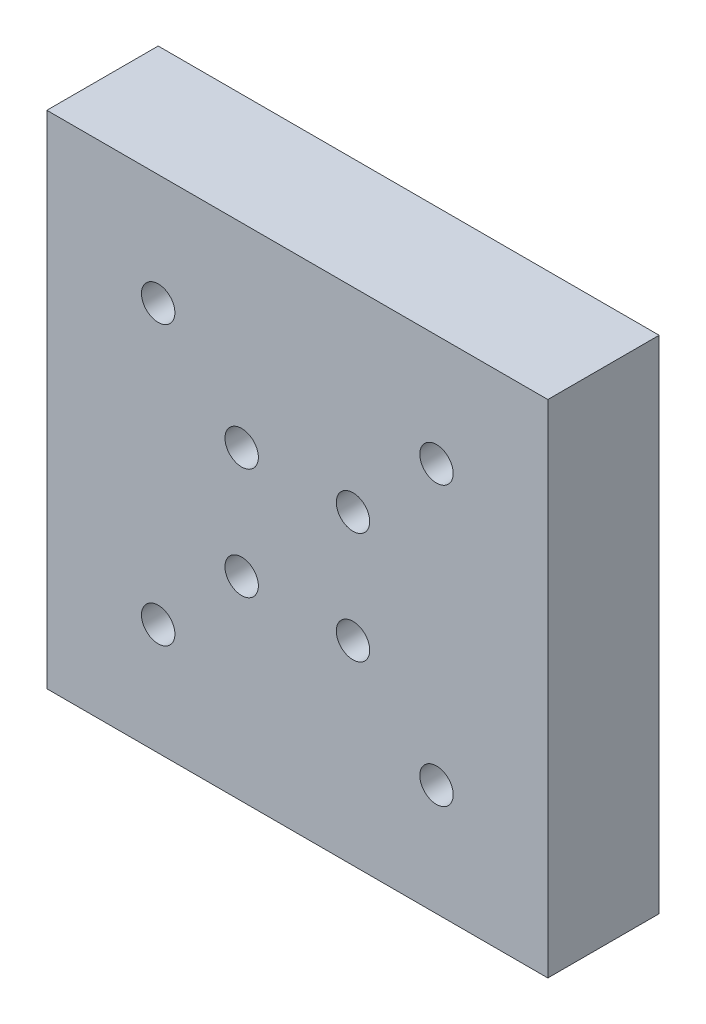
ISO-10303-21;
HEADER;
FILE_DESCRIPTION(('STEP AP214'),'2;1');
FILE_NAME('part.step','',(''),(''),'','','');
FILE_SCHEMA(('AUTOMOTIVE_DESIGN { 1 0 10303 214 1 1 1 1 }'));
ENDSEC;
DATA;
#1=APPLICATION_CONTEXT('core data for automotive mechanical design processes');
#2=APPLICATION_PROTOCOL_DEFINITION('international standard','automotive_design',2000,#1);
#3=PRODUCT_CONTEXT('',#1,'mechanical');
#4=PRODUCT('Part','Part','',(#3));
#5=PRODUCT_RELATED_PRODUCT_CATEGORY('part','',(#4));
#6=PRODUCT_DEFINITION_FORMATION('','',#4);
#7=PRODUCT_DEFINITION_CONTEXT('part definition',#1,'design');
#8=PRODUCT_DEFINITION('design','',#6,#7);
#9=PRODUCT_DEFINITION_SHAPE('','',#8);
#10=(LENGTH_UNIT() NAMED_UNIT(*) SI_UNIT(.MILLI.,.METRE.));
#11=(NAMED_UNIT(*) PLANE_ANGLE_UNIT() SI_UNIT($,.RADIAN.));
#12=(NAMED_UNIT(*) SI_UNIT($,.STERADIAN.) SOLID_ANGLE_UNIT());
#13=UNCERTAINTY_MEASURE_WITH_UNIT(LENGTH_MEASURE(1.E-05),#10,'distance_accuracy_value','');
#14=(GEOMETRIC_REPRESENTATION_CONTEXT(3) GLOBAL_UNCERTAINTY_ASSIGNED_CONTEXT((#13)) GLOBAL_UNIT_ASSIGNED_CONTEXT((#10,
#11,#12)) REPRESENTATION_CONTEXT('',''));
#15=CARTESIAN_POINT('',(0.,0.,0.));
#16=DIRECTION('',(0.,0.,1.));
#17=DIRECTION('',(1.,0.,0.));
#18=AXIS2_PLACEMENT_3D('',#15,#16,#17);
#19=CARTESIAN_POINT('',(22.5,22.5,10.));
#20=DIRECTION('',(-1.,0.,0.));
#21=DIRECTION('',(0.,-1.,0.));
#22=AXIS2_PLACEMENT_3D('',#19,#20,#21);
#23=PLANE('',#22);
#24=DIRECTION('',(0.,1.,0.));
#25=VECTOR('',#24,1.);
#26=CARTESIAN_POINT('',(22.5,22.5,0.));
#27=LINE('',#26,#25);
#28=CARTESIAN_POINT('',(22.5,-22.5,0.));
#29=VERTEX_POINT('',#28);
#30=CARTESIAN_POINT('',(22.5,22.5,0.));
#31=VERTEX_POINT('',#30);
#32=EDGE_CURVE('E104',#29,#31,#27,.T.);
#33=ORIENTED_EDGE('',*,*,#32,.T.);
#34=DIRECTION('',(0.,0.,-1.));
#35=VECTOR('',#34,1.);
#36=CARTESIAN_POINT('',(22.5,22.5,10.));
#37=LINE('',#36,#35);
#38=CARTESIAN_POINT('',(22.5,22.5,10.));
#39=VERTEX_POINT('',#38);
#40=EDGE_CURVE('E11',#39,#31,#37,.T.);
#41=ORIENTED_EDGE('',*,*,#40,.F.);
#42=DIRECTION('',(0.,1.,0.));
#43=VECTOR('',#42,1.);
#44=CARTESIAN_POINT('',(22.5,22.5,10.));
#45=LINE('',#44,#43);
#46=CARTESIAN_POINT('',(22.5,-22.5,10.));
#47=VERTEX_POINT('',#46);
#48=EDGE_CURVE('E92',#47,#39,#45,.T.);
#49=ORIENTED_EDGE('',*,*,#48,.F.);
#50=DIRECTION('',(0.,0.,-1.));
#51=VECTOR('',#50,1.);
#52=CARTESIAN_POINT('',(22.5,-22.5,10.));
#53=LINE('',#52,#51);
#54=EDGE_CURVE('E100',#47,#29,#53,.T.);
#55=ORIENTED_EDGE('',*,*,#54,.T.);
#56=EDGE_LOOP('',(#33,#41,#49,#55));
#57=FACE_BOUND('',#56,.T.);
#58=ADVANCED_FACE('F41',(#57),#23,.F.);
#59=CARTESIAN_POINT('',(-22.5,22.5,10.));
#60=DIRECTION('',(0.,-1.,0.));
#61=DIRECTION('',(0.,0.,-1.));
#62=AXIS2_PLACEMENT_3D('',#59,#60,#61);
#63=PLANE('',#62);
#64=DIRECTION('',(-1.,0.,0.));
#65=VECTOR('',#64,1.);
#66=CARTESIAN_POINT('',(-22.5,22.5,0.));
#67=LINE('',#66,#65);
#68=CARTESIAN_POINT('',(-22.5,22.5,0.));
#69=VERTEX_POINT('',#68);
#70=EDGE_CURVE('E96',#31,#69,#67,.T.);
#71=ORIENTED_EDGE('',*,*,#70,.T.);
#72=DIRECTION('',(0.,0.,-1.));
#73=VECTOR('',#72,1.);
#74=CARTESIAN_POINT('',(-22.5,22.5,10.));
#75=LINE('',#74,#73);
#76=CARTESIAN_POINT('',(-22.5,22.5,10.));
#77=VERTEX_POINT('',#76);
#78=EDGE_CURVE('E49',#77,#69,#75,.T.);
#79=ORIENTED_EDGE('',*,*,#78,.F.);
#80=DIRECTION('',(-1.,0.,0.));
#81=VECTOR('',#80,1.);
#82=CARTESIAN_POINT('',(-22.5,22.5,10.));
#83=LINE('',#82,#81);
#84=EDGE_CURVE('E87',#39,#77,#83,.T.);
#85=ORIENTED_EDGE('',*,*,#84,.F.);
#86=ORIENTED_EDGE('',*,*,#40,.T.);
#87=EDGE_LOOP('',(#71,#79,#85,#86));
#88=FACE_BOUND('',#87,.T.);
#89=ADVANCED_FACE('F95',(#88),#63,.F.);
#90=CARTESIAN_POINT('',(-22.5,22.5,10.));
#91=DIRECTION('',(1.,0.,0.));
#92=DIRECTION('',(0.,1.,0.));
#93=AXIS2_PLACEMENT_3D('',#90,#91,#92);
#94=PLANE('',#93);
#95=DIRECTION('',(0.,-1.,0.));
#96=VECTOR('',#95,1.);
#97=CARTESIAN_POINT('',(-22.5,22.5,0.));
#98=LINE('',#97,#96);
#99=CARTESIAN_POINT('',(-22.5,-22.5,0.));
#100=VERTEX_POINT('',#99);
#101=EDGE_CURVE('E74',#69,#100,#98,.T.);
#102=ORIENTED_EDGE('',*,*,#101,.T.);
#103=DIRECTION('',(0.,0.,-1.));
#104=VECTOR('',#103,1.);
#105=CARTESIAN_POINT('',(-22.5,-22.5,10.));
#106=LINE('',#105,#104);
#107=CARTESIAN_POINT('',(-22.5,-22.5,10.));
#108=VERTEX_POINT('',#107);
#109=EDGE_CURVE('E97',#108,#100,#106,.T.);
#110=ORIENTED_EDGE('',*,*,#109,.F.);
#111=DIRECTION('',(0.,-1.,0.));
#112=VECTOR('',#111,1.);
#113=CARTESIAN_POINT('',(-22.5,22.5,10.));
#114=LINE('',#113,#112);
#115=EDGE_CURVE('E90',#77,#108,#114,.T.);
#116=ORIENTED_EDGE('',*,*,#115,.F.);
#117=ORIENTED_EDGE('',*,*,#78,.T.);
#118=EDGE_LOOP('',(#102,#110,#116,#117));
#119=FACE_BOUND('',#118,.T.);
#120=ADVANCED_FACE('F98',(#119),#94,.F.);
#121=CARTESIAN_POINT('',(-22.5,-22.5,10.));
#122=DIRECTION('',(0.,1.,0.));
#123=DIRECTION('',(0.,0.,1.));
#124=AXIS2_PLACEMENT_3D('',#121,#122,#123);
#125=PLANE('',#124);
#126=DIRECTION('',(1.,0.,0.));
#127=VECTOR('',#126,1.);
#128=CARTESIAN_POINT('',(-22.5,-22.5,0.));
#129=LINE('',#128,#127);
#130=EDGE_CURVE('E80',#100,#29,#129,.T.);
#131=ORIENTED_EDGE('',*,*,#130,.T.);
#132=ORIENTED_EDGE('',*,*,#54,.F.);
#133=DIRECTION('',(1.,0.,0.));
#134=VECTOR('',#133,1.);
#135=CARTESIAN_POINT('',(-22.5,-22.5,10.));
#136=LINE('',#135,#134);
#137=EDGE_CURVE('E57',#108,#47,#136,.T.);
#138=ORIENTED_EDGE('',*,*,#137,.F.);
#139=ORIENTED_EDGE('',*,*,#109,.T.);
#140=EDGE_LOOP('',(#131,#132,#138,#139));
#141=FACE_BOUND('',#140,.T.);
#142=ADVANCED_FACE('F112',(#141),#125,.F.);
#143=CARTESIAN_POINT('',(0.,0.,10.));
#144=DIRECTION('',(0.,0.,1.));
#145=DIRECTION('',(1.,0.,0.));
#146=AXIS2_PLACEMENT_3D('',#143,#144,#145);
#147=PLANE('',#146);
#148=CARTESIAN_POINT('',(-5.,-5.,10.));
#149=DIRECTION('',(0.,0.,1.));
#150=DIRECTION('',(1.,0.,0.));
#151=AXIS2_PLACEMENT_3D('',#148,#149,#150);
#152=CIRCLE('',#151,1.5);
#153=CARTESIAN_POINT('',(-3.5,-5.,10.));
#154=VERTEX_POINT('',#153);
#155=EDGE_CURVE('E151',#154,#154,#152,.T.);
#156=ORIENTED_EDGE('',*,*,#155,.F.);
#157=EDGE_LOOP('',(#156));
#158=FACE_BOUND('',#157,.T.);
#159=CARTESIAN_POINT('',(5.,-5.,10.));
#160=DIRECTION('',(0.,0.,1.));
#161=DIRECTION('',(1.,0.,0.));
#162=AXIS2_PLACEMENT_3D('',#159,#160,#161);
#163=CIRCLE('',#162,1.5);
#164=CARTESIAN_POINT('',(6.5,-5.,10.));
#165=VERTEX_POINT('',#164);
#166=EDGE_CURVE('E157',#165,#165,#163,.T.);
#167=ORIENTED_EDGE('',*,*,#166,.F.);
#168=EDGE_LOOP('',(#167));
#169=FACE_BOUND('',#168,.T.);
#170=CARTESIAN_POINT('',(5.,5.,10.));
#171=DIRECTION('',(0.,0.,1.));
#172=DIRECTION('',(1.,0.,0.));
#173=AXIS2_PLACEMENT_3D('',#170,#171,#172);
#174=CIRCLE('',#173,1.5);
#175=CARTESIAN_POINT('',(6.5,5.,10.));
#176=VERTEX_POINT('',#175);
#177=EDGE_CURVE('E145',#176,#176,#174,.T.);
#178=ORIENTED_EDGE('',*,*,#177,.F.);
#179=EDGE_LOOP('',(#178));
#180=FACE_BOUND('',#179,.T.);
#181=CARTESIAN_POINT('',(-5.,5.,10.));
#182=DIRECTION('',(0.,0.,1.));
#183=DIRECTION('',(1.,0.,0.));
#184=AXIS2_PLACEMENT_3D('',#181,#182,#183);
#185=CIRCLE('',#184,1.5);
#186=CARTESIAN_POINT('',(-3.5,5.,10.));
#187=VERTEX_POINT('',#186);
#188=EDGE_CURVE('E142',#187,#187,#185,.T.);
#189=ORIENTED_EDGE('',*,*,#188,.F.);
#190=EDGE_LOOP('',(#189));
#191=FACE_BOUND('',#190,.T.);
#192=CARTESIAN_POINT('',(-12.5,-12.5,10.));
#193=DIRECTION('',(0.,0.,1.));
#194=DIRECTION('',(1.,0.,0.));
#195=AXIS2_PLACEMENT_3D('',#192,#193,#194);
#196=CIRCLE('',#195,1.5);
#197=CARTESIAN_POINT('',(-11.,-12.5,10.));
#198=VERTEX_POINT('',#197);
#199=EDGE_CURVE('E127',#198,#198,#196,.T.);
#200=ORIENTED_EDGE('',*,*,#199,.F.);
#201=EDGE_LOOP('',(#200));
#202=FACE_BOUND('',#201,.T.);
#203=CARTESIAN_POINT('',(12.5,-12.5,10.));
#204=DIRECTION('',(0.,0.,1.));
#205=DIRECTION('',(1.,0.,0.));
#206=AXIS2_PLACEMENT_3D('',#203,#204,#205);
#207=CIRCLE('',#206,1.5);
#208=CARTESIAN_POINT('',(14.,-12.5,10.));
#209=VERTEX_POINT('',#208);
#210=EDGE_CURVE('E134',#209,#209,#207,.T.);
#211=ORIENTED_EDGE('',*,*,#210,.F.);
#212=EDGE_LOOP('',(#211));
#213=FACE_BOUND('',#212,.T.);
#214=CARTESIAN_POINT('',(12.5,12.5,10.));
#215=DIRECTION('',(0.,0.,1.));
#216=DIRECTION('',(1.,0.,0.));
#217=AXIS2_PLACEMENT_3D('',#214,#215,#216);
#218=CIRCLE('',#217,1.5);
#219=CARTESIAN_POINT('',(14.,12.5,10.));
#220=VERTEX_POINT('',#219);
#221=EDGE_CURVE('E121',#220,#220,#218,.T.);
#222=ORIENTED_EDGE('',*,*,#221,.F.);
#223=EDGE_LOOP('',(#222));
#224=FACE_BOUND('',#223,.T.);
#225=CARTESIAN_POINT('',(-12.5,12.5,10.));
#226=DIRECTION('',(0.,0.,1.));
#227=DIRECTION('',(1.,0.,0.));
#228=AXIS2_PLACEMENT_3D('',#225,#226,#227);
#229=CIRCLE('',#228,1.5);
#230=CARTESIAN_POINT('',(-11.,12.5,10.));
#231=VERTEX_POINT('',#230);
#232=EDGE_CURVE('E118',#231,#231,#229,.T.);
#233=ORIENTED_EDGE('',*,*,#232,.F.);
#234=EDGE_LOOP('',(#233));
#235=FACE_BOUND('',#234,.T.);
#236=ORIENTED_EDGE('',*,*,#48,.T.);
#237=ORIENTED_EDGE('',*,*,#84,.T.);
#238=ORIENTED_EDGE('',*,*,#115,.T.);
#239=ORIENTED_EDGE('',*,*,#137,.T.);
#240=EDGE_LOOP('',(#236,#237,#238,#239));
#241=FACE_BOUND('',#240,.T.);
#242=ADVANCED_FACE('F88',(#158,#169,#180,#191,#202,#213,#224,#235,#241),#147,.T.);
#243=CARTESIAN_POINT('',(0.,0.,0.));
#244=DIRECTION('',(0.,0.,1.));
#245=DIRECTION('',(1.,0.,0.));
#246=AXIS2_PLACEMENT_3D('',#243,#244,#245);
#247=PLANE('',#246);
#248=CARTESIAN_POINT('',(-5.,-5.,0.));
#249=DIRECTION('',(0.,0.,1.));
#250=DIRECTION('',(1.,0.,0.));
#251=AXIS2_PLACEMENT_3D('',#248,#249,#250);
#252=CIRCLE('',#251,1.5);
#253=CARTESIAN_POINT('',(-3.5,-5.,0.));
#254=VERTEX_POINT('',#253);
#255=EDGE_CURVE('E148',#254,#254,#252,.T.);
#256=ORIENTED_EDGE('',*,*,#255,.T.);
#257=EDGE_LOOP('',(#256));
#258=FACE_BOUND('',#257,.T.);
#259=CARTESIAN_POINT('',(5.,-5.,0.));
#260=DIRECTION('',(0.,0.,1.));
#261=DIRECTION('',(1.,0.,0.));
#262=AXIS2_PLACEMENT_3D('',#259,#260,#261);
#263=CIRCLE('',#262,1.5);
#264=CARTESIAN_POINT('',(6.5,-5.,0.));
#265=VERTEX_POINT('',#264);
#266=EDGE_CURVE('E154',#265,#265,#263,.T.);
#267=ORIENTED_EDGE('',*,*,#266,.T.);
#268=EDGE_LOOP('',(#267));
#269=FACE_BOUND('',#268,.T.);
#270=CARTESIAN_POINT('',(5.,5.,0.));
#271=DIRECTION('',(0.,0.,1.));
#272=DIRECTION('',(1.,0.,0.));
#273=AXIS2_PLACEMENT_3D('',#270,#271,#272);
#274=CIRCLE('',#273,1.5);
#275=CARTESIAN_POINT('',(6.5,5.,0.));
#276=VERTEX_POINT('',#275);
#277=EDGE_CURVE('E160',#276,#276,#274,.T.);
#278=ORIENTED_EDGE('',*,*,#277,.T.);
#279=EDGE_LOOP('',(#278));
#280=FACE_BOUND('',#279,.T.);
#281=CARTESIAN_POINT('',(-5.,5.,0.));
#282=DIRECTION('',(0.,0.,1.));
#283=DIRECTION('',(1.,0.,0.));
#284=AXIS2_PLACEMENT_3D('',#281,#282,#283);
#285=CIRCLE('',#284,1.5);
#286=CARTESIAN_POINT('',(-3.5,5.,0.));
#287=VERTEX_POINT('',#286);
#288=EDGE_CURVE('E128',#287,#287,#285,.T.);
#289=ORIENTED_EDGE('',*,*,#288,.T.);
#290=EDGE_LOOP('',(#289));
#291=FACE_BOUND('',#290,.T.);
#292=CARTESIAN_POINT('',(-12.5,-12.5,0.));
#293=DIRECTION('',(0.,0.,1.));
#294=DIRECTION('',(1.,0.,0.));
#295=AXIS2_PLACEMENT_3D('',#292,#293,#294);
#296=CIRCLE('',#295,1.5);
#297=CARTESIAN_POINT('',(-11.,-12.5,0.));
#298=VERTEX_POINT('',#297);
#299=EDGE_CURVE('E124',#298,#298,#296,.T.);
#300=ORIENTED_EDGE('',*,*,#299,.T.);
#301=EDGE_LOOP('',(#300));
#302=FACE_BOUND('',#301,.T.);
#303=CARTESIAN_POINT('',(12.5,-12.5,0.));
#304=DIRECTION('',(0.,0.,1.));
#305=DIRECTION('',(1.,0.,0.));
#306=AXIS2_PLACEMENT_3D('',#303,#304,#305);
#307=CIRCLE('',#306,1.5);
#308=CARTESIAN_POINT('',(14.,-12.5,0.));
#309=VERTEX_POINT('',#308);
#310=EDGE_CURVE('E131',#309,#309,#307,.T.);
#311=ORIENTED_EDGE('',*,*,#310,.T.);
#312=EDGE_LOOP('',(#311));
#313=FACE_BOUND('',#312,.T.);
#314=CARTESIAN_POINT('',(12.5,12.5,0.));
#315=DIRECTION('',(0.,0.,1.));
#316=DIRECTION('',(1.,0.,0.));
#317=AXIS2_PLACEMENT_3D('',#314,#315,#316);
#318=CIRCLE('',#317,1.5);
#319=CARTESIAN_POINT('',(14.,12.5,0.));
#320=VERTEX_POINT('',#319);
#321=EDGE_CURVE('E137',#320,#320,#318,.T.);
#322=ORIENTED_EDGE('',*,*,#321,.T.);
#323=EDGE_LOOP('',(#322));
#324=FACE_BOUND('',#323,.T.);
#325=CARTESIAN_POINT('',(-12.5,12.5,0.));
#326=DIRECTION('',(0.,0.,1.));
#327=DIRECTION('',(1.,0.,0.));
#328=AXIS2_PLACEMENT_3D('',#325,#326,#327);
#329=CIRCLE('',#328,1.5);
#330=CARTESIAN_POINT('',(-11.,12.5,0.));
#331=VERTEX_POINT('',#330);
#332=EDGE_CURVE('E107',#331,#331,#329,.T.);
#333=ORIENTED_EDGE('',*,*,#332,.T.);
#334=EDGE_LOOP('',(#333));
#335=FACE_BOUND('',#334,.T.);
#336=ORIENTED_EDGE('',*,*,#32,.F.);
#337=ORIENTED_EDGE('',*,*,#130,.F.);
#338=ORIENTED_EDGE('',*,*,#101,.F.);
#339=ORIENTED_EDGE('',*,*,#70,.F.);
#340=EDGE_LOOP('',(#336,#337,#338,#339));
#341=FACE_BOUND('',#340,.T.);
#342=ADVANCED_FACE('F115',(#258,#269,#280,#291,#302,#313,#324,#335,#341),#247,.F.);
#343=CARTESIAN_POINT('',(-12.5,12.5,0.));
#344=DIRECTION('',(0.,0.,1.));
#345=DIRECTION('',(1.,0.,0.));
#346=AXIS2_PLACEMENT_3D('',#343,#344,#345);
#347=CYLINDRICAL_SURFACE('',#346,1.5);
#348=ORIENTED_EDGE('',*,*,#332,.F.);
#349=EDGE_LOOP('',(#348));
#350=FACE_BOUND('',#349,.T.);
#351=ORIENTED_EDGE('',*,*,#232,.T.);
#352=EDGE_LOOP('',(#351));
#353=FACE_BOUND('',#352,.T.);
#354=ADVANCED_FACE('F182',(#350,#353),#347,.F.);
#355=CARTESIAN_POINT('',(12.5,12.5,0.));
#356=DIRECTION('',(0.,0.,1.));
#357=DIRECTION('',(1.,0.,0.));
#358=AXIS2_PLACEMENT_3D('',#355,#356,#357);
#359=CYLINDRICAL_SURFACE('',#358,1.5);
#360=ORIENTED_EDGE('',*,*,#321,.F.);
#361=EDGE_LOOP('',(#360));
#362=FACE_BOUND('',#361,.T.);
#363=ORIENTED_EDGE('',*,*,#221,.T.);
#364=EDGE_LOOP('',(#363));
#365=FACE_BOUND('',#364,.T.);
#366=ADVANCED_FACE('F184',(#362,#365),#359,.F.);
#367=CARTESIAN_POINT('',(12.5,-12.5,0.));
#368=DIRECTION('',(0.,0.,1.));
#369=DIRECTION('',(1.,0.,0.));
#370=AXIS2_PLACEMENT_3D('',#367,#368,#369);
#371=CYLINDRICAL_SURFACE('',#370,1.5);
#372=ORIENTED_EDGE('',*,*,#310,.F.);
#373=EDGE_LOOP('',(#372));
#374=FACE_BOUND('',#373,.T.);
#375=ORIENTED_EDGE('',*,*,#210,.T.);
#376=EDGE_LOOP('',(#375));
#377=FACE_BOUND('',#376,.T.);
#378=ADVANCED_FACE('F191',(#374,#377),#371,.F.);
#379=CARTESIAN_POINT('',(-12.5,-12.5,0.));
#380=DIRECTION('',(0.,0.,1.));
#381=DIRECTION('',(1.,0.,0.));
#382=AXIS2_PLACEMENT_3D('',#379,#380,#381);
#383=CYLINDRICAL_SURFACE('',#382,1.5);
#384=ORIENTED_EDGE('',*,*,#299,.F.);
#385=EDGE_LOOP('',(#384));
#386=FACE_BOUND('',#385,.T.);
#387=ORIENTED_EDGE('',*,*,#199,.T.);
#388=EDGE_LOOP('',(#387));
#389=FACE_BOUND('',#388,.T.);
#390=ADVANCED_FACE('F252',(#386,#389),#383,.F.);
#391=CARTESIAN_POINT('',(-5.,5.,0.));
#392=DIRECTION('',(0.,0.,1.));
#393=DIRECTION('',(1.,0.,0.));
#394=AXIS2_PLACEMENT_3D('',#391,#392,#393);
#395=CYLINDRICAL_SURFACE('',#394,1.5);
#396=ORIENTED_EDGE('',*,*,#288,.F.);
#397=EDGE_LOOP('',(#396));
#398=FACE_BOUND('',#397,.T.);
#399=ORIENTED_EDGE('',*,*,#188,.T.);
#400=EDGE_LOOP('',(#399));
#401=FACE_BOUND('',#400,.T.);
#402=ADVANCED_FACE('F261',(#398,#401),#395,.F.);
#403=CARTESIAN_POINT('',(5.,5.,0.));
#404=DIRECTION('',(0.,0.,1.));
#405=DIRECTION('',(1.,0.,0.));
#406=AXIS2_PLACEMENT_3D('',#403,#404,#405);
#407=CYLINDRICAL_SURFACE('',#406,1.5);
#408=ORIENTED_EDGE('',*,*,#277,.F.);
#409=EDGE_LOOP('',(#408));
#410=FACE_BOUND('',#409,.T.);
#411=ORIENTED_EDGE('',*,*,#177,.T.);
#412=EDGE_LOOP('',(#411));
#413=FACE_BOUND('',#412,.T.);
#414=ADVANCED_FACE('F166',(#410,#413),#407,.F.);
#415=CARTESIAN_POINT('',(5.,-5.,0.));
#416=DIRECTION('',(0.,0.,1.));
#417=DIRECTION('',(1.,0.,0.));
#418=AXIS2_PLACEMENT_3D('',#415,#416,#417);
#419=CYLINDRICAL_SURFACE('',#418,1.5);
#420=ORIENTED_EDGE('',*,*,#266,.F.);
#421=EDGE_LOOP('',(#420));
#422=FACE_BOUND('',#421,.T.);
#423=ORIENTED_EDGE('',*,*,#166,.T.);
#424=EDGE_LOOP('',(#423));
#425=FACE_BOUND('',#424,.T.);
#426=ADVANCED_FACE('F277',(#422,#425),#419,.F.);
#427=CARTESIAN_POINT('',(-5.,-5.,0.));
#428=DIRECTION('',(0.,0.,1.));
#429=DIRECTION('',(1.,0.,0.));
#430=AXIS2_PLACEMENT_3D('',#427,#428,#429);
#431=CYLINDRICAL_SURFACE('',#430,1.5);
#432=ORIENTED_EDGE('',*,*,#255,.F.);
#433=EDGE_LOOP('',(#432));
#434=FACE_BOUND('',#433,.T.);
#435=ORIENTED_EDGE('',*,*,#155,.T.);
#436=EDGE_LOOP('',(#435));
#437=FACE_BOUND('',#436,.T.);
#438=ADVANCED_FACE('F286',(#434,#437),#431,.F.);
#439=CLOSED_SHELL('',(#58,#89,#120,#142,#242,#342,#354,#366,#378,#390,#402,#414,#426,#438));
#440=MANIFOLD_SOLID_BREP('B2',#439);
#441=ADVANCED_BREP_SHAPE_REPRESENTATION('',(#18,#440),#14);
#442=SHAPE_DEFINITION_REPRESENTATION(#9,#441);
ENDSEC;
END-ISO-10303-21;
